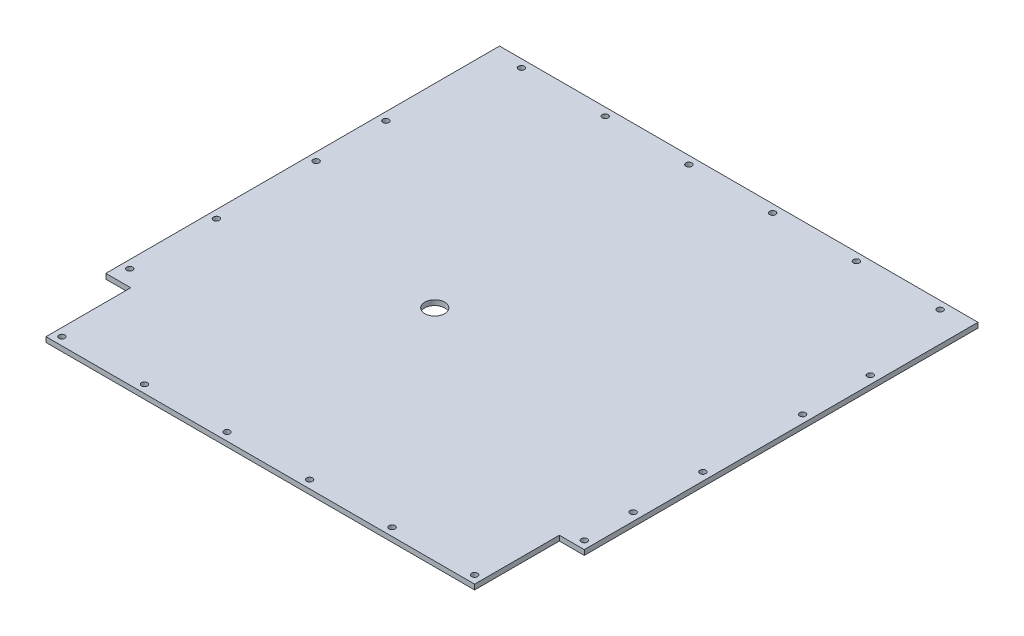
ISO-10303-21;
HEADER;
FILE_DESCRIPTION(('STEP AP214'),'2;1');
FILE_NAME('part.step','',(''),(''),'','','');
FILE_SCHEMA(('AUTOMOTIVE_DESIGN { 1 0 10303 214 1 1 1 1 }'));
ENDSEC;
DATA;
#1=APPLICATION_CONTEXT('core data for automotive mechanical design processes');
#2=APPLICATION_PROTOCOL_DEFINITION('international standard','automotive_design',2000,#1);
#3=PRODUCT_CONTEXT('',#1,'mechanical');
#4=PRODUCT('Part','Part','',(#3));
#5=PRODUCT_RELATED_PRODUCT_CATEGORY('part','',(#4));
#6=PRODUCT_DEFINITION_FORMATION('','',#4);
#7=PRODUCT_DEFINITION_CONTEXT('part definition',#1,'design');
#8=PRODUCT_DEFINITION('design','',#6,#7);
#9=PRODUCT_DEFINITION_SHAPE('','',#8);
#10=(LENGTH_UNIT() NAMED_UNIT(*) SI_UNIT(.MILLI.,.METRE.));
#11=(NAMED_UNIT(*) PLANE_ANGLE_UNIT() SI_UNIT($,.RADIAN.));
#12=(NAMED_UNIT(*) SI_UNIT($,.STERADIAN.) SOLID_ANGLE_UNIT());
#13=UNCERTAINTY_MEASURE_WITH_UNIT(LENGTH_MEASURE(1.E-05),#10,'distance_accuracy_value','');
#14=(GEOMETRIC_REPRESENTATION_CONTEXT(3) GLOBAL_UNCERTAINTY_ASSIGNED_CONTEXT((#13)) GLOBAL_UNIT_ASSIGNED_CONTEXT((#10,
#11,#12)) REPRESENTATION_CONTEXT('',''));
#15=CARTESIAN_POINT('',(0.,0.,0.));
#16=DIRECTION('',(0.,0.,1.));
#17=DIRECTION('',(1.,0.,0.));
#18=AXIS2_PLACEMENT_3D('',#15,#16,#17);
#19=CARTESIAN_POINT('',(0.,0.,0.));
#20=DIRECTION('',(0.,1.,0.));
#21=DIRECTION('',(0.,0.,1.));
#22=AXIS2_PLACEMENT_3D('',#19,#20,#21);
#23=PLANE('',#22);
#24=CARTESIAN_POINT('',(-62.1,0.,116.));
#25=DIRECTION('',(0.,-1.,0.));
#26=DIRECTION('',(0.,0.,-1.));
#27=AXIS2_PLACEMENT_3D('',#24,#25,#26);
#28=CIRCLE('',#27,1.49999999999999);
#29=CARTESIAN_POINT('',(-62.1,0.,114.5));
#30=VERTEX_POINT('',#29);
#31=EDGE_CURVE('E300',#30,#30,#28,.T.);
#32=ORIENTED_EDGE('',*,*,#31,.F.);
#33=EDGE_LOOP('',(#32));
#34=FACE_BOUND('',#33,.T.);
#35=CARTESIAN_POINT('',(20.7,0.,116.));
#36=DIRECTION('',(0.,-1.,0.));
#37=DIRECTION('',(0.,0.,-1.));
#38=AXIS2_PLACEMENT_3D('',#35,#36,#37);
#39=CIRCLE('',#38,1.49999999999999);
#40=CARTESIAN_POINT('',(20.7,0.,114.5));
#41=VERTEX_POINT('',#40);
#42=EDGE_CURVE('E315',#41,#41,#39,.T.);
#43=ORIENTED_EDGE('',*,*,#42,.F.);
#44=EDGE_LOOP('',(#43));
#45=FACE_BOUND('',#44,.T.);
#46=CARTESIAN_POINT('',(103.5,0.,116.));
#47=DIRECTION('',(0.,-1.,0.));
#48=DIRECTION('',(0.,0.,-1.));
#49=AXIS2_PLACEMENT_3D('',#46,#47,#48);
#50=CIRCLE('',#49,1.49999999999999);
#51=CARTESIAN_POINT('',(103.5,0.,114.5));
#52=VERTEX_POINT('',#51);
#53=EDGE_CURVE('E327',#52,#52,#50,.T.);
#54=ORIENTED_EDGE('',*,*,#53,.F.);
#55=EDGE_LOOP('',(#54));
#56=FACE_BOUND('',#55,.T.);
#57=CARTESIAN_POINT('',(116.,0.,49.));
#58=DIRECTION('',(0.,-1.,0.));
#59=DIRECTION('',(0.,0.,-1.));
#60=AXIS2_PLACEMENT_3D('',#57,#58,#59);
#61=CIRCLE('',#60,1.49999999999999);
#62=CARTESIAN_POINT('',(116.,0.,47.5));
#63=VERTEX_POINT('',#62);
#64=EDGE_CURVE('E339',#63,#63,#61,.T.);
#65=ORIENTED_EDGE('',*,*,#64,.F.);
#66=EDGE_LOOP('',(#65));
#67=FACE_BOUND('',#66,.T.);
#68=CARTESIAN_POINT('',(116.,0.,14.));
#69=DIRECTION('',(0.,-1.,0.));
#70=DIRECTION('',(0.,0.,-1.));
#71=AXIS2_PLACEMENT_3D('',#68,#69,#70);
#72=CIRCLE('',#71,1.49999999999999);
#73=CARTESIAN_POINT('',(116.,0.,12.5));
#74=VERTEX_POINT('',#73);
#75=EDGE_CURVE('E345',#74,#74,#72,.T.);
#76=ORIENTED_EDGE('',*,*,#75,.F.);
#77=EDGE_LOOP('',(#76));
#78=FACE_BOUND('',#77,.T.);
#79=CARTESIAN_POINT('',(116.,0.,-70.));
#80=DIRECTION('',(0.,-1.,0.));
#81=DIRECTION('',(0.,0.,-1.));
#82=AXIS2_PLACEMENT_3D('',#79,#80,#81);
#83=CIRCLE('',#82,1.49999999999999);
#84=CARTESIAN_POINT('',(116.,0.,-71.5));
#85=VERTEX_POINT('',#84);
#86=EDGE_CURVE('E357',#85,#85,#83,.T.);
#87=ORIENTED_EDGE('',*,*,#86,.F.);
#88=EDGE_LOOP('',(#87));
#89=FACE_BOUND('',#88,.T.);
#90=CARTESIAN_POINT('',(105.,0.,-116.));
#91=DIRECTION('',(0.,-1.,0.));
#92=DIRECTION('',(0.,0.,-1.));
#93=AXIS2_PLACEMENT_3D('',#90,#91,#92);
#94=CIRCLE('',#93,1.49999999999999);
#95=CARTESIAN_POINT('',(105.,0.,-117.5));
#96=VERTEX_POINT('',#95);
#97=EDGE_CURVE('E363',#96,#96,#94,.T.);
#98=ORIENTED_EDGE('',*,*,#97,.F.);
#99=EDGE_LOOP('',(#98));
#100=FACE_BOUND('',#99,.T.);
#101=CARTESIAN_POINT('',(-116.,0.,-59.));
#102=DIRECTION('',(0.,-1.,0.));
#103=DIRECTION('',(0.,0.,-1.));
#104=AXIS2_PLACEMENT_3D('',#101,#102,#103);
#105=CIRCLE('',#104,1.49999999999999);
#106=CARTESIAN_POINT('',(-116.,0.,-60.5));
#107=VERTEX_POINT('',#106);
#108=EDGE_CURVE('E399',#107,#107,#105,.T.);
#109=ORIENTED_EDGE('',*,*,#108,.F.);
#110=EDGE_LOOP('',(#109));
#111=FACE_BOUND('',#110,.T.);
#112=CARTESIAN_POINT('',(-116.,0.,-24.));
#113=DIRECTION('',(0.,-1.,0.));
#114=DIRECTION('',(0.,0.,-1.));
#115=AXIS2_PLACEMENT_3D('',#112,#113,#114);
#116=CIRCLE('',#115,1.49999999999999);
#117=CARTESIAN_POINT('',(-116.,0.,-25.5));
#118=VERTEX_POINT('',#117);
#119=EDGE_CURVE('E405',#118,#118,#116,.T.);
#120=ORIENTED_EDGE('',*,*,#119,.F.);
#121=EDGE_LOOP('',(#120));
#122=FACE_BOUND('',#121,.T.);
#123=CARTESIAN_POINT('',(-116.,0.,69.5));
#124=DIRECTION('',(0.,-1.,0.));
#125=DIRECTION('',(0.,0.,-1.));
#126=AXIS2_PLACEMENT_3D('',#123,#124,#125);
#127=CIRCLE('',#126,1.49999999999999);
#128=CARTESIAN_POINT('',(-116.,0.,68.));
#129=VERTEX_POINT('',#128);
#130=EDGE_CURVE('E417',#129,#129,#127,.T.);
#131=ORIENTED_EDGE('',*,*,#130,.F.);
#132=EDGE_LOOP('',(#131));
#133=FACE_BOUND('',#132,.T.);
#134=CARTESIAN_POINT('',(-22.5,0.,10.));
#135=DIRECTION('',(0.,1.,0.));
#136=DIRECTION('',(0.,0.,1.));
#137=AXIS2_PLACEMENT_3D('',#134,#135,#136);
#138=CIRCLE('',#137,5.);
#139=CARTESIAN_POINT('',(-22.5,0.,15.));
#140=VERTEX_POINT('',#139);
#141=EDGE_CURVE('E133',#140,#140,#138,.T.);
#142=ORIENTED_EDGE('',*,*,#141,.T.);
#143=EDGE_LOOP('',(#142));
#144=FACE_BOUND('',#143,.T.);
#145=DIRECTION('',(1.,0.,0.));
#146=VECTOR('',#145,1.);
#147=CARTESIAN_POINT('',(0.,0.,120.));
#148=LINE('',#147,#146);
#149=CARTESIAN_POINT('',(-107.5,0.,120.));
#150=VERTEX_POINT('',#149);
#151=CARTESIAN_POINT('',(107.5,0.,120.));
#152=VERTEX_POINT('',#151);
#153=EDGE_CURVE('E136',#150,#152,#148,.T.);
#154=ORIENTED_EDGE('',*,*,#153,.F.);
#155=DIRECTION('',(0.,0.,-1.));
#156=VECTOR('',#155,1.);
#157=CARTESIAN_POINT('',(-107.5,0.,0.));
#158=LINE('',#157,#156);
#159=CARTESIAN_POINT('',(-107.5,0.,77.5));
#160=VERTEX_POINT('',#159);
#161=EDGE_CURVE('E154',#150,#160,#158,.T.);
#162=ORIENTED_EDGE('',*,*,#161,.T.);
#163=DIRECTION('',(1.,0.,0.));
#164=VECTOR('',#163,1.);
#165=CARTESIAN_POINT('',(0.,0.,77.5));
#166=LINE('',#165,#164);
#167=CARTESIAN_POINT('',(-120.,0.,77.5));
#168=VERTEX_POINT('',#167);
#169=EDGE_CURVE('E152',#168,#160,#166,.T.);
#170=ORIENTED_EDGE('',*,*,#169,.F.);
#171=DIRECTION('',(0.,0.,1.));
#172=VECTOR('',#171,1.);
#173=CARTESIAN_POINT('',(-120.,0.,0.));
#174=LINE('',#173,#172);
#175=CARTESIAN_POINT('',(-120.,0.,-120.));
#176=VERTEX_POINT('',#175);
#177=EDGE_CURVE('E122',#176,#168,#174,.T.);
#178=ORIENTED_EDGE('',*,*,#177,.F.);
#179=DIRECTION('',(1.,0.,0.));
#180=VECTOR('',#179,1.);
#181=CARTESIAN_POINT('',(0.,0.,-120.));
#182=LINE('',#181,#180);
#183=CARTESIAN_POINT('',(120.,0.,-120.));
#184=VERTEX_POINT('',#183);
#185=EDGE_CURVE('E148',#176,#184,#182,.T.);
#186=ORIENTED_EDGE('',*,*,#185,.T.);
#187=DIRECTION('',(0.,0.,1.));
#188=VECTOR('',#187,1.);
#189=CARTESIAN_POINT('',(120.,0.,0.));
#190=LINE('',#189,#188);
#191=CARTESIAN_POINT('',(120.,0.,77.5));
#192=VERTEX_POINT('',#191);
#193=EDGE_CURVE('E145',#184,#192,#190,.T.);
#194=ORIENTED_EDGE('',*,*,#193,.T.);
#195=DIRECTION('',(-1.,0.,0.));
#196=VECTOR('',#195,1.);
#197=CARTESIAN_POINT('',(0.,0.,77.5));
#198=LINE('',#197,#196);
#199=CARTESIAN_POINT('',(107.5,0.,77.5));
#200=VERTEX_POINT('',#199);
#201=EDGE_CURVE('E142',#192,#200,#198,.T.);
#202=ORIENTED_EDGE('',*,*,#201,.T.);
#203=DIRECTION('',(0.,0.,-1.));
#204=VECTOR('',#203,1.);
#205=CARTESIAN_POINT('',(107.5,0.,0.));
#206=LINE('',#205,#204);
#207=EDGE_CURVE('E139',#152,#200,#206,.T.);
#208=ORIENTED_EDGE('',*,*,#207,.F.);
#209=EDGE_LOOP('',(#154,#162,#170,#178,#186,#194,#202,#208));
#210=FACE_BOUND('',#209,.T.);
#211=CARTESIAN_POINT('',(-116.,0.,26.));
#212=DIRECTION('',(0.,-1.,0.));
#213=DIRECTION('',(0.,0.,-1.));
#214=AXIS2_PLACEMENT_3D('',#211,#212,#213);
#215=CIRCLE('',#214,1.49999999999999);
#216=CARTESIAN_POINT('',(-116.,0.,24.5));
#217=VERTEX_POINT('',#216);
#218=EDGE_CURVE('E411',#217,#217,#215,.T.);
#219=ORIENTED_EDGE('',*,*,#218,.F.);
#220=EDGE_LOOP('',(#219));
#221=FACE_BOUND('',#220,.T.);
#222=CARTESIAN_POINT('',(-105.,0.,-116.));
#223=DIRECTION('',(0.,-1.,0.));
#224=DIRECTION('',(0.,0.,-1.));
#225=AXIS2_PLACEMENT_3D('',#222,#223,#224);
#226=CIRCLE('',#225,1.49999999999999);
#227=CARTESIAN_POINT('',(-105.,0.,-117.5));
#228=VERTEX_POINT('',#227);
#229=EDGE_CURVE('E393',#228,#228,#226,.T.);
#230=ORIENTED_EDGE('',*,*,#229,.F.);
#231=EDGE_LOOP('',(#230));
#232=FACE_BOUND('',#231,.T.);
#233=CARTESIAN_POINT('',(-63.,0.,-116.));
#234=DIRECTION('',(0.,-1.,0.));
#235=DIRECTION('',(0.,0.,-1.));
#236=AXIS2_PLACEMENT_3D('',#233,#234,#235);
#237=CIRCLE('',#236,1.49999999999999);
#238=CARTESIAN_POINT('',(-63.,0.,-117.5));
#239=VERTEX_POINT('',#238);
#240=EDGE_CURVE('E387',#239,#239,#237,.T.);
#241=ORIENTED_EDGE('',*,*,#240,.F.);
#242=EDGE_LOOP('',(#241));
#243=FACE_BOUND('',#242,.T.);
#244=CARTESIAN_POINT('',(-21.,0.,-116.));
#245=DIRECTION('',(0.,-1.,0.));
#246=DIRECTION('',(0.,0.,-1.));
#247=AXIS2_PLACEMENT_3D('',#244,#245,#246);
#248=CIRCLE('',#247,1.49999999999999);
#249=CARTESIAN_POINT('',(-21.,0.,-117.5));
#250=VERTEX_POINT('',#249);
#251=EDGE_CURVE('E381',#250,#250,#248,.T.);
#252=ORIENTED_EDGE('',*,*,#251,.F.);
#253=EDGE_LOOP('',(#252));
#254=FACE_BOUND('',#253,.T.);
#255=CARTESIAN_POINT('',(21.,0.,-116.));
#256=DIRECTION('',(0.,-1.,0.));
#257=DIRECTION('',(0.,0.,-1.));
#258=AXIS2_PLACEMENT_3D('',#255,#256,#257);
#259=CIRCLE('',#258,1.49999999999999);
#260=CARTESIAN_POINT('',(21.,0.,-117.5));
#261=VERTEX_POINT('',#260);
#262=EDGE_CURVE('E375',#261,#261,#259,.T.);
#263=ORIENTED_EDGE('',*,*,#262,.F.);
#264=EDGE_LOOP('',(#263));
#265=FACE_BOUND('',#264,.T.);
#266=CARTESIAN_POINT('',(63.,0.,-116.));
#267=DIRECTION('',(0.,-1.,0.));
#268=DIRECTION('',(0.,0.,-1.));
#269=AXIS2_PLACEMENT_3D('',#266,#267,#268);
#270=CIRCLE('',#269,1.49999999999999);
#271=CARTESIAN_POINT('',(63.,0.,-117.5));
#272=VERTEX_POINT('',#271);
#273=EDGE_CURVE('E369',#272,#272,#270,.T.);
#274=ORIENTED_EDGE('',*,*,#273,.F.);
#275=EDGE_LOOP('',(#274));
#276=FACE_BOUND('',#275,.T.);
#277=CARTESIAN_POINT('',(116.,0.,-36.));
#278=DIRECTION('',(0.,-1.,0.));
#279=DIRECTION('',(0.,0.,-1.));
#280=AXIS2_PLACEMENT_3D('',#277,#278,#279);
#281=CIRCLE('',#280,1.49999999999999);
#282=CARTESIAN_POINT('',(116.,0.,-37.5));
#283=VERTEX_POINT('',#282);
#284=EDGE_CURVE('E351',#283,#283,#281,.T.);
#285=ORIENTED_EDGE('',*,*,#284,.F.);
#286=EDGE_LOOP('',(#285));
#287=FACE_BOUND('',#286,.T.);
#288=CARTESIAN_POINT('',(116.,0.,73.5));
#289=DIRECTION('',(0.,-1.,0.));
#290=DIRECTION('',(0.,0.,-1.));
#291=AXIS2_PLACEMENT_3D('',#288,#289,#290);
#292=CIRCLE('',#291,1.49999999999999);
#293=CARTESIAN_POINT('',(116.,0.,72.));
#294=VERTEX_POINT('',#293);
#295=EDGE_CURVE('E333',#294,#294,#292,.T.);
#296=ORIENTED_EDGE('',*,*,#295,.F.);
#297=EDGE_LOOP('',(#296));
#298=FACE_BOUND('',#297,.T.);
#299=CARTESIAN_POINT('',(62.1,0.,116.));
#300=DIRECTION('',(0.,-1.,0.));
#301=DIRECTION('',(0.,0.,-1.));
#302=AXIS2_PLACEMENT_3D('',#299,#300,#301);
#303=CIRCLE('',#302,1.49999999999999);
#304=CARTESIAN_POINT('',(62.1,0.,114.5));
#305=VERTEX_POINT('',#304);
#306=EDGE_CURVE('E321',#305,#305,#303,.T.);
#307=ORIENTED_EDGE('',*,*,#306,.F.);
#308=EDGE_LOOP('',(#307));
#309=FACE_BOUND('',#308,.T.);
#310=CARTESIAN_POINT('',(-20.7,0.,116.));
#311=DIRECTION('',(0.,-1.,0.));
#312=DIRECTION('',(0.,0.,-1.));
#313=AXIS2_PLACEMENT_3D('',#310,#311,#312);
#314=CIRCLE('',#313,1.49999999999999);
#315=CARTESIAN_POINT('',(-20.7,0.,114.5));
#316=VERTEX_POINT('',#315);
#317=EDGE_CURVE('E309',#316,#316,#314,.T.);
#318=ORIENTED_EDGE('',*,*,#317,.F.);
#319=EDGE_LOOP('',(#318));
#320=FACE_BOUND('',#319,.T.);
#321=CARTESIAN_POINT('',(-103.5,0.,116.));
#322=DIRECTION('',(0.,-1.,0.));
#323=DIRECTION('',(0.,0.,-1.));
#324=AXIS2_PLACEMENT_3D('',#321,#322,#323);
#325=CIRCLE('',#324,1.49999999999999);
#326=CARTESIAN_POINT('',(-103.5,0.,114.5));
#327=VERTEX_POINT('',#326);
#328=EDGE_CURVE('E296',#327,#327,#325,.T.);
#329=ORIENTED_EDGE('',*,*,#328,.F.);
#330=EDGE_LOOP('',(#329));
#331=FACE_BOUND('',#330,.T.);
#332=ADVANCED_FACE('F35',(#34,#45,#56,#67,#78,#89,#100,#111,#122,#133,#144,#210,#221,#232,#243,
#254,#265,#276,#287,#298,#309,#320,#331),#23,.F.);
#333=CARTESIAN_POINT('',(0.,2.54,120.));
#334=DIRECTION('',(0.,0.,-1.));
#335=DIRECTION('',(-1.,0.,0.));
#336=AXIS2_PLACEMENT_3D('',#333,#334,#335);
#337=PLANE('',#336);
#338=ORIENTED_EDGE('',*,*,#153,.T.);
#339=DIRECTION('',(0.,-1.,0.));
#340=VECTOR('',#339,1.);
#341=CARTESIAN_POINT('',(107.5,2.54,120.));
#342=LINE('',#341,#340);
#343=CARTESIAN_POINT('',(107.5,2.54,120.));
#344=VERTEX_POINT('',#343);
#345=EDGE_CURVE('E11',#344,#152,#342,.T.);
#346=ORIENTED_EDGE('',*,*,#345,.F.);
#347=DIRECTION('',(1.,0.,0.));
#348=VECTOR('',#347,1.);
#349=CARTESIAN_POINT('',(0.,2.54,120.));
#350=LINE('',#349,#348);
#351=CARTESIAN_POINT('',(-107.5,2.54,120.));
#352=VERTEX_POINT('',#351);
#353=EDGE_CURVE('E182',#352,#344,#350,.T.);
#354=ORIENTED_EDGE('',*,*,#353,.F.);
#355=DIRECTION('',(0.,-1.,0.));
#356=VECTOR('',#355,1.);
#357=CARTESIAN_POINT('',(-107.5,2.54,120.));
#358=LINE('',#357,#356);
#359=EDGE_CURVE('E52',#352,#150,#358,.T.);
#360=ORIENTED_EDGE('',*,*,#359,.T.);
#361=EDGE_LOOP('',(#338,#346,#354,#360));
#362=FACE_BOUND('',#361,.T.);
#363=ADVANCED_FACE('F201',(#362),#337,.F.);
#364=CARTESIAN_POINT('',(107.5,2.54,0.));
#365=DIRECTION('',(-1.,0.,0.));
#366=DIRECTION('',(0.,0.,1.));
#367=AXIS2_PLACEMENT_3D('',#364,#365,#366);
#368=PLANE('',#367);
#369=ORIENTED_EDGE('',*,*,#207,.T.);
#370=DIRECTION('',(0.,-1.,0.));
#371=VECTOR('',#370,1.);
#372=CARTESIAN_POINT('',(107.5,2.54,77.5));
#373=LINE('',#372,#371);
#374=CARTESIAN_POINT('',(107.5,2.54,77.5));
#375=VERTEX_POINT('',#374);
#376=EDGE_CURVE('E44',#375,#200,#373,.T.);
#377=ORIENTED_EDGE('',*,*,#376,.F.);
#378=DIRECTION('',(0.,0.,-1.));
#379=VECTOR('',#378,1.);
#380=CARTESIAN_POINT('',(107.5,2.54,0.));
#381=LINE('',#380,#379);
#382=EDGE_CURVE('E91',#344,#375,#381,.T.);
#383=ORIENTED_EDGE('',*,*,#382,.F.);
#384=ORIENTED_EDGE('',*,*,#345,.T.);
#385=EDGE_LOOP('',(#369,#377,#383,#384));
#386=FACE_BOUND('',#385,.T.);
#387=ADVANCED_FACE('F170',(#386),#368,.F.);
#388=CARTESIAN_POINT('',(0.,2.54,77.5));
#389=DIRECTION('',(0.,0.,1.));
#390=DIRECTION('',(1.,0.,0.));
#391=AXIS2_PLACEMENT_3D('',#388,#389,#390);
#392=PLANE('',#391);
#393=ORIENTED_EDGE('',*,*,#201,.F.);
#394=DIRECTION('',(0.,-1.,0.));
#395=VECTOR('',#394,1.);
#396=CARTESIAN_POINT('',(120.,2.54,77.5));
#397=LINE('',#396,#395);
#398=CARTESIAN_POINT('',(120.,2.54,77.5));
#399=VERTEX_POINT('',#398);
#400=EDGE_CURVE('E163',#399,#192,#397,.T.);
#401=ORIENTED_EDGE('',*,*,#400,.F.);
#402=DIRECTION('',(-1.,0.,0.));
#403=VECTOR('',#402,1.);
#404=CARTESIAN_POINT('',(0.,2.54,77.5));
#405=LINE('',#404,#403);
#406=EDGE_CURVE('E169',#399,#375,#405,.T.);
#407=ORIENTED_EDGE('',*,*,#406,.T.);
#408=ORIENTED_EDGE('',*,*,#376,.T.);
#409=EDGE_LOOP('',(#393,#401,#407,#408));
#410=FACE_BOUND('',#409,.T.);
#411=ADVANCED_FACE('F167',(#410),#392,.T.);
#412=CARTESIAN_POINT('',(120.,2.54,0.));
#413=DIRECTION('',(1.,0.,0.));
#414=DIRECTION('',(0.,0.,-1.));
#415=AXIS2_PLACEMENT_3D('',#412,#413,#414);
#416=PLANE('',#415);
#417=ORIENTED_EDGE('',*,*,#193,.F.);
#418=DIRECTION('',(0.,-1.,0.));
#419=VECTOR('',#418,1.);
#420=CARTESIAN_POINT('',(120.,2.54,-120.));
#421=LINE('',#420,#419);
#422=CARTESIAN_POINT('',(120.,2.54,-120.));
#423=VERTEX_POINT('',#422);
#424=EDGE_CURVE('E161',#423,#184,#421,.T.);
#425=ORIENTED_EDGE('',*,*,#424,.F.);
#426=DIRECTION('',(0.,0.,1.));
#427=VECTOR('',#426,1.);
#428=CARTESIAN_POINT('',(120.,2.54,0.));
#429=LINE('',#428,#427);
#430=EDGE_CURVE('E179',#423,#399,#429,.T.);
#431=ORIENTED_EDGE('',*,*,#430,.T.);
#432=ORIENTED_EDGE('',*,*,#400,.T.);
#433=EDGE_LOOP('',(#417,#425,#431,#432));
#434=FACE_BOUND('',#433,.T.);
#435=ADVANCED_FACE('F177',(#434),#416,.T.);
#436=CARTESIAN_POINT('',(0.,2.54,-120.));
#437=DIRECTION('',(0.,0.,-1.));
#438=DIRECTION('',(-1.,0.,0.));
#439=AXIS2_PLACEMENT_3D('',#436,#437,#438);
#440=PLANE('',#439);
#441=ORIENTED_EDGE('',*,*,#185,.F.);
#442=DIRECTION('',(0.,-1.,0.));
#443=VECTOR('',#442,1.);
#444=CARTESIAN_POINT('',(-120.,2.54,-120.));
#445=LINE('',#444,#443);
#446=CARTESIAN_POINT('',(-120.,2.54,-120.));
#447=VERTEX_POINT('',#446);
#448=EDGE_CURVE('E125',#447,#176,#445,.T.);
#449=ORIENTED_EDGE('',*,*,#448,.F.);
#450=DIRECTION('',(1.,0.,0.));
#451=VECTOR('',#450,1.);
#452=CARTESIAN_POINT('',(0.,2.54,-120.));
#453=LINE('',#452,#451);
#454=EDGE_CURVE('E115',#447,#423,#453,.T.);
#455=ORIENTED_EDGE('',*,*,#454,.T.);
#456=ORIENTED_EDGE('',*,*,#424,.T.);
#457=EDGE_LOOP('',(#441,#449,#455,#456));
#458=FACE_BOUND('',#457,.T.);
#459=ADVANCED_FACE('F186',(#458),#440,.T.);
#460=CARTESIAN_POINT('',(-120.,2.54,0.));
#461=DIRECTION('',(1.,0.,0.));
#462=DIRECTION('',(0.,0.,-1.));
#463=AXIS2_PLACEMENT_3D('',#460,#461,#462);
#464=PLANE('',#463);
#465=ORIENTED_EDGE('',*,*,#177,.T.);
#466=DIRECTION('',(0.,-1.,0.));
#467=VECTOR('',#466,1.);
#468=CARTESIAN_POINT('',(-120.,2.54,77.5));
#469=LINE('',#468,#467);
#470=CARTESIAN_POINT('',(-120.,2.54,77.5));
#471=VERTEX_POINT('',#470);
#472=EDGE_CURVE('E119',#471,#168,#469,.T.);
#473=ORIENTED_EDGE('',*,*,#472,.F.);
#474=DIRECTION('',(0.,0.,1.));
#475=VECTOR('',#474,1.);
#476=CARTESIAN_POINT('',(-120.,2.54,0.));
#477=LINE('',#476,#475);
#478=EDGE_CURVE('E107',#447,#471,#477,.T.);
#479=ORIENTED_EDGE('',*,*,#478,.F.);
#480=ORIENTED_EDGE('',*,*,#448,.T.);
#481=EDGE_LOOP('',(#465,#473,#479,#480));
#482=FACE_BOUND('',#481,.T.);
#483=ADVANCED_FACE('F120',(#482),#464,.F.);
#484=CARTESIAN_POINT('',(0.,2.54,77.5));
#485=DIRECTION('',(0.,0.,-1.));
#486=DIRECTION('',(-1.,0.,0.));
#487=AXIS2_PLACEMENT_3D('',#484,#485,#486);
#488=PLANE('',#487);
#489=ORIENTED_EDGE('',*,*,#169,.T.);
#490=DIRECTION('',(0.,-1.,0.));
#491=VECTOR('',#490,1.);
#492=CARTESIAN_POINT('',(-107.5,2.54,77.5));
#493=LINE('',#492,#491);
#494=CARTESIAN_POINT('',(-107.5,2.54,77.5));
#495=VERTEX_POINT('',#494);
#496=EDGE_CURVE('E79',#495,#160,#493,.T.);
#497=ORIENTED_EDGE('',*,*,#496,.F.);
#498=DIRECTION('',(1.,0.,0.));
#499=VECTOR('',#498,1.);
#500=CARTESIAN_POINT('',(0.,2.54,77.5));
#501=LINE('',#500,#499);
#502=EDGE_CURVE('E112',#471,#495,#501,.T.);
#503=ORIENTED_EDGE('',*,*,#502,.F.);
#504=ORIENTED_EDGE('',*,*,#472,.T.);
#505=EDGE_LOOP('',(#489,#497,#503,#504));
#506=FACE_BOUND('',#505,.T.);
#507=ADVANCED_FACE('F127',(#506),#488,.F.);
#508=CARTESIAN_POINT('',(-22.5,2.54,10.));
#509=DIRECTION('',(0.,-1.,0.));
#510=DIRECTION('',(0.,0.,-1.));
#511=AXIS2_PLACEMENT_3D('',#508,#509,#510);
#512=CYLINDRICAL_SURFACE('',#511,5.);
#513=CARTESIAN_POINT('',(-22.5,2.54,10.));
#514=DIRECTION('',(0.,1.,0.));
#515=DIRECTION('',(0.,0.,1.));
#516=AXIS2_PLACEMENT_3D('',#513,#514,#515);
#517=CIRCLE('',#516,5.);
#518=CARTESIAN_POINT('',(-22.5,2.54,15.));
#519=VERTEX_POINT('',#518);
#520=EDGE_CURVE('E157',#519,#519,#517,.T.);
#521=ORIENTED_EDGE('',*,*,#520,.T.);
#522=EDGE_LOOP('',(#521));
#523=FACE_BOUND('',#522,.T.);
#524=ORIENTED_EDGE('',*,*,#141,.F.);
#525=EDGE_LOOP('',(#524));
#526=FACE_BOUND('',#525,.T.);
#527=ADVANCED_FACE('F37',(#523,#526),#512,.F.);
#528=CARTESIAN_POINT('',(-107.5,2.54,0.));
#529=DIRECTION('',(-1.,0.,0.));
#530=DIRECTION('',(0.,0.,1.));
#531=AXIS2_PLACEMENT_3D('',#528,#529,#530);
#532=PLANE('',#531);
#533=ORIENTED_EDGE('',*,*,#161,.F.);
#534=ORIENTED_EDGE('',*,*,#359,.F.);
#535=DIRECTION('',(0.,0.,-1.));
#536=VECTOR('',#535,1.);
#537=CARTESIAN_POINT('',(-107.5,2.54,0.));
#538=LINE('',#537,#536);
#539=EDGE_CURVE('E128',#352,#495,#538,.T.);
#540=ORIENTED_EDGE('',*,*,#539,.T.);
#541=ORIENTED_EDGE('',*,*,#496,.T.);
#542=EDGE_LOOP('',(#533,#534,#540,#541));
#543=FACE_BOUND('',#542,.T.);
#544=ADVANCED_FACE('F187',(#543),#532,.T.);
#545=CARTESIAN_POINT('',(0.,2.54,0.));
#546=DIRECTION('',(0.,1.,0.));
#547=DIRECTION('',(0.,0.,1.));
#548=AXIS2_PLACEMENT_3D('',#545,#546,#547);
#549=PLANE('',#548);
#550=CARTESIAN_POINT('',(-103.5,2.54,116.));
#551=DIRECTION('',(0.,1.,0.));
#552=DIRECTION('',(0.,0.,1.));
#553=AXIS2_PLACEMENT_3D('',#550,#551,#552);
#554=CIRCLE('',#553,1.49999999999999);
#555=CARTESIAN_POINT('',(-103.5,2.54,117.5));
#556=VERTEX_POINT('',#555);
#557=EDGE_CURVE('E299',#556,#556,#554,.T.);
#558=ORIENTED_EDGE('',*,*,#557,.F.);
#559=EDGE_LOOP('',(#558));
#560=FACE_BOUND('',#559,.T.);
#561=CARTESIAN_POINT('',(-62.1,2.54,116.));
#562=DIRECTION('',(0.,1.,0.));
#563=DIRECTION('',(0.,0.,1.));
#564=AXIS2_PLACEMENT_3D('',#561,#562,#563);
#565=CIRCLE('',#564,1.49999999999999);
#566=CARTESIAN_POINT('',(-62.1,2.54,117.5));
#567=VERTEX_POINT('',#566);
#568=EDGE_CURVE('E303',#567,#567,#565,.T.);
#569=ORIENTED_EDGE('',*,*,#568,.F.);
#570=EDGE_LOOP('',(#569));
#571=FACE_BOUND('',#570,.T.);
#572=CARTESIAN_POINT('',(-20.7,2.54,116.));
#573=DIRECTION('',(0.,1.,0.));
#574=DIRECTION('',(0.,0.,1.));
#575=AXIS2_PLACEMENT_3D('',#572,#573,#574);
#576=CIRCLE('',#575,1.49999999999999);
#577=CARTESIAN_POINT('',(-20.7,2.54,117.5));
#578=VERTEX_POINT('',#577);
#579=EDGE_CURVE('E312',#578,#578,#576,.T.);
#580=ORIENTED_EDGE('',*,*,#579,.F.);
#581=EDGE_LOOP('',(#580));
#582=FACE_BOUND('',#581,.T.);
#583=CARTESIAN_POINT('',(20.7,2.54,116.));
#584=DIRECTION('',(0.,1.,0.));
#585=DIRECTION('',(0.,0.,1.));
#586=AXIS2_PLACEMENT_3D('',#583,#584,#585);
#587=CIRCLE('',#586,1.49999999999999);
#588=CARTESIAN_POINT('',(20.7,2.54,117.5));
#589=VERTEX_POINT('',#588);
#590=EDGE_CURVE('E318',#589,#589,#587,.T.);
#591=ORIENTED_EDGE('',*,*,#590,.F.);
#592=EDGE_LOOP('',(#591));
#593=FACE_BOUND('',#592,.T.);
#594=CARTESIAN_POINT('',(62.1,2.54,116.));
#595=DIRECTION('',(0.,1.,0.));
#596=DIRECTION('',(0.,0.,1.));
#597=AXIS2_PLACEMENT_3D('',#594,#595,#596);
#598=CIRCLE('',#597,1.49999999999999);
#599=CARTESIAN_POINT('',(62.1,2.54,117.5));
#600=VERTEX_POINT('',#599);
#601=EDGE_CURVE('E324',#600,#600,#598,.T.);
#602=ORIENTED_EDGE('',*,*,#601,.F.);
#603=EDGE_LOOP('',(#602));
#604=FACE_BOUND('',#603,.T.);
#605=CARTESIAN_POINT('',(103.5,2.54,116.));
#606=DIRECTION('',(0.,1.,0.));
#607=DIRECTION('',(0.,0.,1.));
#608=AXIS2_PLACEMENT_3D('',#605,#606,#607);
#609=CIRCLE('',#608,1.49999999999999);
#610=CARTESIAN_POINT('',(103.5,2.54,117.5));
#611=VERTEX_POINT('',#610);
#612=EDGE_CURVE('E330',#611,#611,#609,.T.);
#613=ORIENTED_EDGE('',*,*,#612,.F.);
#614=EDGE_LOOP('',(#613));
#615=FACE_BOUND('',#614,.T.);
#616=CARTESIAN_POINT('',(116.,2.54,73.5));
#617=DIRECTION('',(0.,1.,0.));
#618=DIRECTION('',(0.,0.,1.));
#619=AXIS2_PLACEMENT_3D('',#616,#617,#618);
#620=CIRCLE('',#619,1.49999999999999);
#621=CARTESIAN_POINT('',(116.,2.54,75.));
#622=VERTEX_POINT('',#621);
#623=EDGE_CURVE('E336',#622,#622,#620,.T.);
#624=ORIENTED_EDGE('',*,*,#623,.F.);
#625=EDGE_LOOP('',(#624));
#626=FACE_BOUND('',#625,.T.);
#627=CARTESIAN_POINT('',(116.,2.54,49.));
#628=DIRECTION('',(0.,1.,0.));
#629=DIRECTION('',(0.,0.,1.));
#630=AXIS2_PLACEMENT_3D('',#627,#628,#629);
#631=CIRCLE('',#630,1.49999999999999);
#632=CARTESIAN_POINT('',(116.,2.54,50.5));
#633=VERTEX_POINT('',#632);
#634=EDGE_CURVE('E342',#633,#633,#631,.T.);
#635=ORIENTED_EDGE('',*,*,#634,.F.);
#636=EDGE_LOOP('',(#635));
#637=FACE_BOUND('',#636,.T.);
#638=CARTESIAN_POINT('',(116.,2.54,14.));
#639=DIRECTION('',(0.,1.,0.));
#640=DIRECTION('',(0.,0.,1.));
#641=AXIS2_PLACEMENT_3D('',#638,#639,#640);
#642=CIRCLE('',#641,1.49999999999999);
#643=CARTESIAN_POINT('',(116.,2.54,15.5));
#644=VERTEX_POINT('',#643);
#645=EDGE_CURVE('E348',#644,#644,#642,.T.);
#646=ORIENTED_EDGE('',*,*,#645,.F.);
#647=EDGE_LOOP('',(#646));
#648=FACE_BOUND('',#647,.T.);
#649=CARTESIAN_POINT('',(116.,2.54,-36.));
#650=DIRECTION('',(0.,1.,0.));
#651=DIRECTION('',(0.,0.,1.));
#652=AXIS2_PLACEMENT_3D('',#649,#650,#651);
#653=CIRCLE('',#652,1.49999999999999);
#654=CARTESIAN_POINT('',(116.,2.54,-34.5));
#655=VERTEX_POINT('',#654);
#656=EDGE_CURVE('E354',#655,#655,#653,.T.);
#657=ORIENTED_EDGE('',*,*,#656,.F.);
#658=EDGE_LOOP('',(#657));
#659=FACE_BOUND('',#658,.T.);
#660=CARTESIAN_POINT('',(116.,2.54,-70.));
#661=DIRECTION('',(0.,1.,0.));
#662=DIRECTION('',(0.,0.,1.));
#663=AXIS2_PLACEMENT_3D('',#660,#661,#662);
#664=CIRCLE('',#663,1.49999999999999);
#665=CARTESIAN_POINT('',(116.,2.54,-68.5));
#666=VERTEX_POINT('',#665);
#667=EDGE_CURVE('E360',#666,#666,#664,.T.);
#668=ORIENTED_EDGE('',*,*,#667,.F.);
#669=EDGE_LOOP('',(#668));
#670=FACE_BOUND('',#669,.T.);
#671=CARTESIAN_POINT('',(105.,2.54,-116.));
#672=DIRECTION('',(0.,1.,0.));
#673=DIRECTION('',(0.,0.,1.));
#674=AXIS2_PLACEMENT_3D('',#671,#672,#673);
#675=CIRCLE('',#674,1.49999999999999);
#676=CARTESIAN_POINT('',(105.,2.54,-114.5));
#677=VERTEX_POINT('',#676);
#678=EDGE_CURVE('E366',#677,#677,#675,.T.);
#679=ORIENTED_EDGE('',*,*,#678,.F.);
#680=EDGE_LOOP('',(#679));
#681=FACE_BOUND('',#680,.T.);
#682=CARTESIAN_POINT('',(63.,2.54,-116.));
#683=DIRECTION('',(0.,1.,0.));
#684=DIRECTION('',(0.,0.,1.));
#685=AXIS2_PLACEMENT_3D('',#682,#683,#684);
#686=CIRCLE('',#685,1.49999999999999);
#687=CARTESIAN_POINT('',(63.,2.54,-114.5));
#688=VERTEX_POINT('',#687);
#689=EDGE_CURVE('E372',#688,#688,#686,.T.);
#690=ORIENTED_EDGE('',*,*,#689,.F.);
#691=EDGE_LOOP('',(#690));
#692=FACE_BOUND('',#691,.T.);
#693=CARTESIAN_POINT('',(21.,2.54,-116.));
#694=DIRECTION('',(0.,1.,0.));
#695=DIRECTION('',(0.,0.,1.));
#696=AXIS2_PLACEMENT_3D('',#693,#694,#695);
#697=CIRCLE('',#696,1.49999999999999);
#698=CARTESIAN_POINT('',(21.,2.54,-114.5));
#699=VERTEX_POINT('',#698);
#700=EDGE_CURVE('E378',#699,#699,#697,.T.);
#701=ORIENTED_EDGE('',*,*,#700,.F.);
#702=EDGE_LOOP('',(#701));
#703=FACE_BOUND('',#702,.T.);
#704=CARTESIAN_POINT('',(-21.,2.54,-116.));
#705=DIRECTION('',(0.,1.,0.));
#706=DIRECTION('',(0.,0.,1.));
#707=AXIS2_PLACEMENT_3D('',#704,#705,#706);
#708=CIRCLE('',#707,1.49999999999999);
#709=CARTESIAN_POINT('',(-21.,2.54,-114.5));
#710=VERTEX_POINT('',#709);
#711=EDGE_CURVE('E384',#710,#710,#708,.T.);
#712=ORIENTED_EDGE('',*,*,#711,.F.);
#713=EDGE_LOOP('',(#712));
#714=FACE_BOUND('',#713,.T.);
#715=CARTESIAN_POINT('',(-63.,2.54,-116.));
#716=DIRECTION('',(0.,1.,0.));
#717=DIRECTION('',(0.,0.,1.));
#718=AXIS2_PLACEMENT_3D('',#715,#716,#717);
#719=CIRCLE('',#718,1.49999999999999);
#720=CARTESIAN_POINT('',(-63.,2.54,-114.5));
#721=VERTEX_POINT('',#720);
#722=EDGE_CURVE('E390',#721,#721,#719,.T.);
#723=ORIENTED_EDGE('',*,*,#722,.F.);
#724=EDGE_LOOP('',(#723));
#725=FACE_BOUND('',#724,.T.);
#726=CARTESIAN_POINT('',(-105.,2.54,-116.));
#727=DIRECTION('',(0.,1.,0.));
#728=DIRECTION('',(0.,0.,1.));
#729=AXIS2_PLACEMENT_3D('',#726,#727,#728);
#730=CIRCLE('',#729,1.49999999999999);
#731=CARTESIAN_POINT('',(-105.,2.54,-114.5));
#732=VERTEX_POINT('',#731);
#733=EDGE_CURVE('E396',#732,#732,#730,.T.);
#734=ORIENTED_EDGE('',*,*,#733,.F.);
#735=EDGE_LOOP('',(#734));
#736=FACE_BOUND('',#735,.T.);
#737=CARTESIAN_POINT('',(-116.,2.54,-59.));
#738=DIRECTION('',(0.,1.,0.));
#739=DIRECTION('',(0.,0.,1.));
#740=AXIS2_PLACEMENT_3D('',#737,#738,#739);
#741=CIRCLE('',#740,1.49999999999999);
#742=CARTESIAN_POINT('',(-116.,2.54,-57.5));
#743=VERTEX_POINT('',#742);
#744=EDGE_CURVE('E402',#743,#743,#741,.T.);
#745=ORIENTED_EDGE('',*,*,#744,.F.);
#746=EDGE_LOOP('',(#745));
#747=FACE_BOUND('',#746,.T.);
#748=CARTESIAN_POINT('',(-116.,2.54,-24.));
#749=DIRECTION('',(0.,1.,0.));
#750=DIRECTION('',(0.,0.,1.));
#751=AXIS2_PLACEMENT_3D('',#748,#749,#750);
#752=CIRCLE('',#751,1.49999999999999);
#753=CARTESIAN_POINT('',(-116.,2.54,-22.5));
#754=VERTEX_POINT('',#753);
#755=EDGE_CURVE('E408',#754,#754,#752,.T.);
#756=ORIENTED_EDGE('',*,*,#755,.F.);
#757=EDGE_LOOP('',(#756));
#758=FACE_BOUND('',#757,.T.);
#759=CARTESIAN_POINT('',(-116.,2.54,26.));
#760=DIRECTION('',(0.,1.,0.));
#761=DIRECTION('',(0.,0.,1.));
#762=AXIS2_PLACEMENT_3D('',#759,#760,#761);
#763=CIRCLE('',#762,1.49999999999999);
#764=CARTESIAN_POINT('',(-116.,2.54,27.5));
#765=VERTEX_POINT('',#764);
#766=EDGE_CURVE('E414',#765,#765,#763,.T.);
#767=ORIENTED_EDGE('',*,*,#766,.F.);
#768=EDGE_LOOP('',(#767));
#769=FACE_BOUND('',#768,.T.);
#770=CARTESIAN_POINT('',(-116.,2.54,69.5));
#771=DIRECTION('',(0.,1.,0.));
#772=DIRECTION('',(0.,0.,1.));
#773=AXIS2_PLACEMENT_3D('',#770,#771,#772);
#774=CIRCLE('',#773,1.49999999999999);
#775=CARTESIAN_POINT('',(-116.,2.54,71.));
#776=VERTEX_POINT('',#775);
#777=EDGE_CURVE('E137',#776,#776,#774,.T.);
#778=ORIENTED_EDGE('',*,*,#777,.F.);
#779=EDGE_LOOP('',(#778));
#780=FACE_BOUND('',#779,.T.);
#781=ORIENTED_EDGE('',*,*,#520,.F.);
#782=EDGE_LOOP('',(#781));
#783=FACE_BOUND('',#782,.T.);
#784=ORIENTED_EDGE('',*,*,#353,.T.);
#785=ORIENTED_EDGE('',*,*,#382,.T.);
#786=ORIENTED_EDGE('',*,*,#406,.F.);
#787=ORIENTED_EDGE('',*,*,#430,.F.);
#788=ORIENTED_EDGE('',*,*,#454,.F.);
#789=ORIENTED_EDGE('',*,*,#478,.T.);
#790=ORIENTED_EDGE('',*,*,#502,.T.);
#791=ORIENTED_EDGE('',*,*,#539,.F.);
#792=EDGE_LOOP('',(#784,#785,#786,#787,#788,#789,#790,#791));
#793=FACE_BOUND('',#792,.T.);
#794=ADVANCED_FACE('F109',(#560,#571,#582,#593,#604,#615,#626,#637,#648,#659,#670,#681,#692,
#703,#714,#725,#736,#747,#758,#769,#780,#783,#793),#549,.T.);
#795=CARTESIAN_POINT('',(-116.,0.,69.5));
#796=DIRECTION('',(0.,-1.,0.));
#797=DIRECTION('',(0.,0.,-1.));
#798=AXIS2_PLACEMENT_3D('',#795,#796,#797);
#799=CYLINDRICAL_SURFACE('',#798,1.49999999999999);
#800=ORIENTED_EDGE('',*,*,#130,.T.);
#801=EDGE_LOOP('',(#800));
#802=FACE_BOUND('',#801,.T.);
#803=ORIENTED_EDGE('',*,*,#777,.T.);
#804=EDGE_LOOP('',(#803));
#805=FACE_BOUND('',#804,.T.);
#806=ADVANCED_FACE('F194',(#802,#805),#799,.F.);
#807=CARTESIAN_POINT('',(-116.,0.,26.));
#808=DIRECTION('',(0.,-1.,0.));
#809=DIRECTION('',(0.,0.,-1.));
#810=AXIS2_PLACEMENT_3D('',#807,#808,#809);
#811=CYLINDRICAL_SURFACE('',#810,1.49999999999999);
#812=ORIENTED_EDGE('',*,*,#218,.T.);
#813=EDGE_LOOP('',(#812));
#814=FACE_BOUND('',#813,.T.);
#815=ORIENTED_EDGE('',*,*,#766,.T.);
#816=EDGE_LOOP('',(#815));
#817=FACE_BOUND('',#816,.T.);
#818=ADVANCED_FACE('F211',(#814,#817),#811,.F.);
#819=CARTESIAN_POINT('',(-116.,0.,-24.));
#820=DIRECTION('',(0.,-1.,0.));
#821=DIRECTION('',(0.,0.,-1.));
#822=AXIS2_PLACEMENT_3D('',#819,#820,#821);
#823=CYLINDRICAL_SURFACE('',#822,1.49999999999999);
#824=ORIENTED_EDGE('',*,*,#119,.T.);
#825=EDGE_LOOP('',(#824));
#826=FACE_BOUND('',#825,.T.);
#827=ORIENTED_EDGE('',*,*,#755,.T.);
#828=EDGE_LOOP('',(#827));
#829=FACE_BOUND('',#828,.T.);
#830=ADVANCED_FACE('F215',(#826,#829),#823,.F.);
#831=CARTESIAN_POINT('',(-116.,0.,-59.));
#832=DIRECTION('',(0.,-1.,0.));
#833=DIRECTION('',(0.,0.,-1.));
#834=AXIS2_PLACEMENT_3D('',#831,#832,#833);
#835=CYLINDRICAL_SURFACE('',#834,1.49999999999999);
#836=ORIENTED_EDGE('',*,*,#108,.T.);
#837=EDGE_LOOP('',(#836));
#838=FACE_BOUND('',#837,.T.);
#839=ORIENTED_EDGE('',*,*,#744,.T.);
#840=EDGE_LOOP('',(#839));
#841=FACE_BOUND('',#840,.T.);
#842=ADVANCED_FACE('F219',(#838,#841),#835,.F.);
#843=CARTESIAN_POINT('',(-105.,0.,-116.));
#844=DIRECTION('',(0.,-1.,0.));
#845=DIRECTION('',(0.,0.,-1.));
#846=AXIS2_PLACEMENT_3D('',#843,#844,#845);
#847=CYLINDRICAL_SURFACE('',#846,1.49999999999999);
#848=ORIENTED_EDGE('',*,*,#229,.T.);
#849=EDGE_LOOP('',(#848));
#850=FACE_BOUND('',#849,.T.);
#851=ORIENTED_EDGE('',*,*,#733,.T.);
#852=EDGE_LOOP('',(#851));
#853=FACE_BOUND('',#852,.T.);
#854=ADVANCED_FACE('F223',(#850,#853),#847,.F.);
#855=CARTESIAN_POINT('',(-63.,0.,-116.));
#856=DIRECTION('',(0.,-1.,0.));
#857=DIRECTION('',(0.,0.,-1.));
#858=AXIS2_PLACEMENT_3D('',#855,#856,#857);
#859=CYLINDRICAL_SURFACE('',#858,1.49999999999999);
#860=ORIENTED_EDGE('',*,*,#240,.T.);
#861=EDGE_LOOP('',(#860));
#862=FACE_BOUND('',#861,.T.);
#863=ORIENTED_EDGE('',*,*,#722,.T.);
#864=EDGE_LOOP('',(#863));
#865=FACE_BOUND('',#864,.T.);
#866=ADVANCED_FACE('F227',(#862,#865),#859,.F.);
#867=CARTESIAN_POINT('',(-21.,0.,-116.));
#868=DIRECTION('',(0.,-1.,0.));
#869=DIRECTION('',(0.,0.,-1.));
#870=AXIS2_PLACEMENT_3D('',#867,#868,#869);
#871=CYLINDRICAL_SURFACE('',#870,1.49999999999999);
#872=ORIENTED_EDGE('',*,*,#251,.T.);
#873=EDGE_LOOP('',(#872));
#874=FACE_BOUND('',#873,.T.);
#875=ORIENTED_EDGE('',*,*,#711,.T.);
#876=EDGE_LOOP('',(#875));
#877=FACE_BOUND('',#876,.T.);
#878=ADVANCED_FACE('F231',(#874,#877),#871,.F.);
#879=CARTESIAN_POINT('',(21.,0.,-116.));
#880=DIRECTION('',(0.,-1.,0.));
#881=DIRECTION('',(0.,0.,-1.));
#882=AXIS2_PLACEMENT_3D('',#879,#880,#881);
#883=CYLINDRICAL_SURFACE('',#882,1.49999999999999);
#884=ORIENTED_EDGE('',*,*,#262,.T.);
#885=EDGE_LOOP('',(#884));
#886=FACE_BOUND('',#885,.T.);
#887=ORIENTED_EDGE('',*,*,#700,.T.);
#888=EDGE_LOOP('',(#887));
#889=FACE_BOUND('',#888,.T.);
#890=ADVANCED_FACE('F235',(#886,#889),#883,.F.);
#891=CARTESIAN_POINT('',(63.,0.,-116.));
#892=DIRECTION('',(0.,-1.,0.));
#893=DIRECTION('',(0.,0.,-1.));
#894=AXIS2_PLACEMENT_3D('',#891,#892,#893);
#895=CYLINDRICAL_SURFACE('',#894,1.49999999999999);
#896=ORIENTED_EDGE('',*,*,#273,.T.);
#897=EDGE_LOOP('',(#896));
#898=FACE_BOUND('',#897,.T.);
#899=ORIENTED_EDGE('',*,*,#689,.T.);
#900=EDGE_LOOP('',(#899));
#901=FACE_BOUND('',#900,.T.);
#902=ADVANCED_FACE('F239',(#898,#901),#895,.F.);
#903=CARTESIAN_POINT('',(105.,0.,-116.));
#904=DIRECTION('',(0.,-1.,0.));
#905=DIRECTION('',(0.,0.,-1.));
#906=AXIS2_PLACEMENT_3D('',#903,#904,#905);
#907=CYLINDRICAL_SURFACE('',#906,1.49999999999999);
#908=ORIENTED_EDGE('',*,*,#97,.T.);
#909=EDGE_LOOP('',(#908));
#910=FACE_BOUND('',#909,.T.);
#911=ORIENTED_EDGE('',*,*,#678,.T.);
#912=EDGE_LOOP('',(#911));
#913=FACE_BOUND('',#912,.T.);
#914=ADVANCED_FACE('F243',(#910,#913),#907,.F.);
#915=CARTESIAN_POINT('',(116.,0.,-70.));
#916=DIRECTION('',(0.,-1.,0.));
#917=DIRECTION('',(0.,0.,-1.));
#918=AXIS2_PLACEMENT_3D('',#915,#916,#917);
#919=CYLINDRICAL_SURFACE('',#918,1.49999999999999);
#920=ORIENTED_EDGE('',*,*,#86,.T.);
#921=EDGE_LOOP('',(#920));
#922=FACE_BOUND('',#921,.T.);
#923=ORIENTED_EDGE('',*,*,#667,.T.);
#924=EDGE_LOOP('',(#923));
#925=FACE_BOUND('',#924,.T.);
#926=ADVANCED_FACE('F247',(#922,#925),#919,.F.);
#927=CARTESIAN_POINT('',(116.,0.,-36.));
#928=DIRECTION('',(0.,-1.,0.));
#929=DIRECTION('',(0.,0.,-1.));
#930=AXIS2_PLACEMENT_3D('',#927,#928,#929);
#931=CYLINDRICAL_SURFACE('',#930,1.49999999999999);
#932=ORIENTED_EDGE('',*,*,#284,.T.);
#933=EDGE_LOOP('',(#932));
#934=FACE_BOUND('',#933,.T.);
#935=ORIENTED_EDGE('',*,*,#656,.T.);
#936=EDGE_LOOP('',(#935));
#937=FACE_BOUND('',#936,.T.);
#938=ADVANCED_FACE('F251',(#934,#937),#931,.F.);
#939=CARTESIAN_POINT('',(116.,0.,14.));
#940=DIRECTION('',(0.,-1.,0.));
#941=DIRECTION('',(0.,0.,-1.));
#942=AXIS2_PLACEMENT_3D('',#939,#940,#941);
#943=CYLINDRICAL_SURFACE('',#942,1.49999999999999);
#944=ORIENTED_EDGE('',*,*,#75,.T.);
#945=EDGE_LOOP('',(#944));
#946=FACE_BOUND('',#945,.T.);
#947=ORIENTED_EDGE('',*,*,#645,.T.);
#948=EDGE_LOOP('',(#947));
#949=FACE_BOUND('',#948,.T.);
#950=ADVANCED_FACE('F255',(#946,#949),#943,.F.);
#951=CARTESIAN_POINT('',(116.,0.,49.));
#952=DIRECTION('',(0.,-1.,0.));
#953=DIRECTION('',(0.,0.,-1.));
#954=AXIS2_PLACEMENT_3D('',#951,#952,#953);
#955=CYLINDRICAL_SURFACE('',#954,1.49999999999999);
#956=ORIENTED_EDGE('',*,*,#64,.T.);
#957=EDGE_LOOP('',(#956));
#958=FACE_BOUND('',#957,.T.);
#959=ORIENTED_EDGE('',*,*,#634,.T.);
#960=EDGE_LOOP('',(#959));
#961=FACE_BOUND('',#960,.T.);
#962=ADVANCED_FACE('F259',(#958,#961),#955,.F.);
#963=CARTESIAN_POINT('',(116.,0.,73.5));
#964=DIRECTION('',(0.,-1.,0.));
#965=DIRECTION('',(0.,0.,-1.));
#966=AXIS2_PLACEMENT_3D('',#963,#964,#965);
#967=CYLINDRICAL_SURFACE('',#966,1.49999999999999);
#968=ORIENTED_EDGE('',*,*,#295,.T.);
#969=EDGE_LOOP('',(#968));
#970=FACE_BOUND('',#969,.T.);
#971=ORIENTED_EDGE('',*,*,#623,.T.);
#972=EDGE_LOOP('',(#971));
#973=FACE_BOUND('',#972,.T.);
#974=ADVANCED_FACE('F263',(#970,#973),#967,.F.);
#975=CARTESIAN_POINT('',(103.5,0.,116.));
#976=DIRECTION('',(0.,-1.,0.));
#977=DIRECTION('',(0.,0.,-1.));
#978=AXIS2_PLACEMENT_3D('',#975,#976,#977);
#979=CYLINDRICAL_SURFACE('',#978,1.49999999999999);
#980=ORIENTED_EDGE('',*,*,#53,.T.);
#981=EDGE_LOOP('',(#980));
#982=FACE_BOUND('',#981,.T.);
#983=ORIENTED_EDGE('',*,*,#612,.T.);
#984=EDGE_LOOP('',(#983));
#985=FACE_BOUND('',#984,.T.);
#986=ADVANCED_FACE('F267',(#982,#985),#979,.F.);
#987=CARTESIAN_POINT('',(62.1,0.,116.));
#988=DIRECTION('',(0.,-1.,0.));
#989=DIRECTION('',(0.,0.,-1.));
#990=AXIS2_PLACEMENT_3D('',#987,#988,#989);
#991=CYLINDRICAL_SURFACE('',#990,1.49999999999999);
#992=ORIENTED_EDGE('',*,*,#306,.T.);
#993=EDGE_LOOP('',(#992));
#994=FACE_BOUND('',#993,.T.);
#995=ORIENTED_EDGE('',*,*,#601,.T.);
#996=EDGE_LOOP('',(#995));
#997=FACE_BOUND('',#996,.T.);
#998=ADVANCED_FACE('F271',(#994,#997),#991,.F.);
#999=CARTESIAN_POINT('',(20.7,0.,116.));
#1000=DIRECTION('',(0.,-1.,0.));
#1001=DIRECTION('',(0.,0.,-1.));
#1002=AXIS2_PLACEMENT_3D('',#999,#1000,#1001);
#1003=CYLINDRICAL_SURFACE('',#1002,1.49999999999999);
#1004=ORIENTED_EDGE('',*,*,#42,.T.);
#1005=EDGE_LOOP('',(#1004));
#1006=FACE_BOUND('',#1005,.T.);
#1007=ORIENTED_EDGE('',*,*,#590,.T.);
#1008=EDGE_LOOP('',(#1007));
#1009=FACE_BOUND('',#1008,.T.);
#1010=ADVANCED_FACE('F275',(#1006,#1009),#1003,.F.);
#1011=CARTESIAN_POINT('',(-20.7,0.,116.));
#1012=DIRECTION('',(0.,-1.,0.));
#1013=DIRECTION('',(0.,0.,-1.));
#1014=AXIS2_PLACEMENT_3D('',#1011,#1012,#1013);
#1015=CYLINDRICAL_SURFACE('',#1014,1.49999999999999);
#1016=ORIENTED_EDGE('',*,*,#317,.T.);
#1017=EDGE_LOOP('',(#1016));
#1018=FACE_BOUND('',#1017,.T.);
#1019=ORIENTED_EDGE('',*,*,#579,.T.);
#1020=EDGE_LOOP('',(#1019));
#1021=FACE_BOUND('',#1020,.T.);
#1022=ADVANCED_FACE('F279',(#1018,#1021),#1015,.F.);
#1023=CARTESIAN_POINT('',(-62.1,0.,116.));
#1024=DIRECTION('',(0.,-1.,0.));
#1025=DIRECTION('',(0.,0.,-1.));
#1026=AXIS2_PLACEMENT_3D('',#1023,#1024,#1025);
#1027=CYLINDRICAL_SURFACE('',#1026,1.49999999999999);
#1028=ORIENTED_EDGE('',*,*,#31,.T.);
#1029=EDGE_LOOP('',(#1028));
#1030=FACE_BOUND('',#1029,.T.);
#1031=ORIENTED_EDGE('',*,*,#568,.T.);
#1032=EDGE_LOOP('',(#1031));
#1033=FACE_BOUND('',#1032,.T.);
#1034=ADVANCED_FACE('F283',(#1030,#1033),#1027,.F.);
#1035=CARTESIAN_POINT('',(-103.5,0.,116.));
#1036=DIRECTION('',(0.,-1.,0.));
#1037=DIRECTION('',(0.,0.,-1.));
#1038=AXIS2_PLACEMENT_3D('',#1035,#1036,#1037);
#1039=CYLINDRICAL_SURFACE('',#1038,1.49999999999999);
#1040=ORIENTED_EDGE('',*,*,#328,.T.);
#1041=EDGE_LOOP('',(#1040));
#1042=FACE_BOUND('',#1041,.T.);
#1043=ORIENTED_EDGE('',*,*,#557,.T.);
#1044=EDGE_LOOP('',(#1043));
#1045=FACE_BOUND('',#1044,.T.);
#1046=ADVANCED_FACE('F287',(#1042,#1045),#1039,.F.);
#1047=CLOSED_SHELL('',(#332,#363,#387,#411,#435,#459,#483,#507,#527,#544,#794,#806,#818,#830,
#842,#854,#866,#878,#890,#902,#914,#926,#938,#950,#962,#974,#986,#998,#1010,#1022,#1034,#1046));
#1048=MANIFOLD_SOLID_BREP('B2',#1047);
#1049=ADVANCED_BREP_SHAPE_REPRESENTATION('',(#18,#1048),#14);
#1050=SHAPE_DEFINITION_REPRESENTATION(#9,#1049);
ENDSEC;
END-ISO-10303-21;
